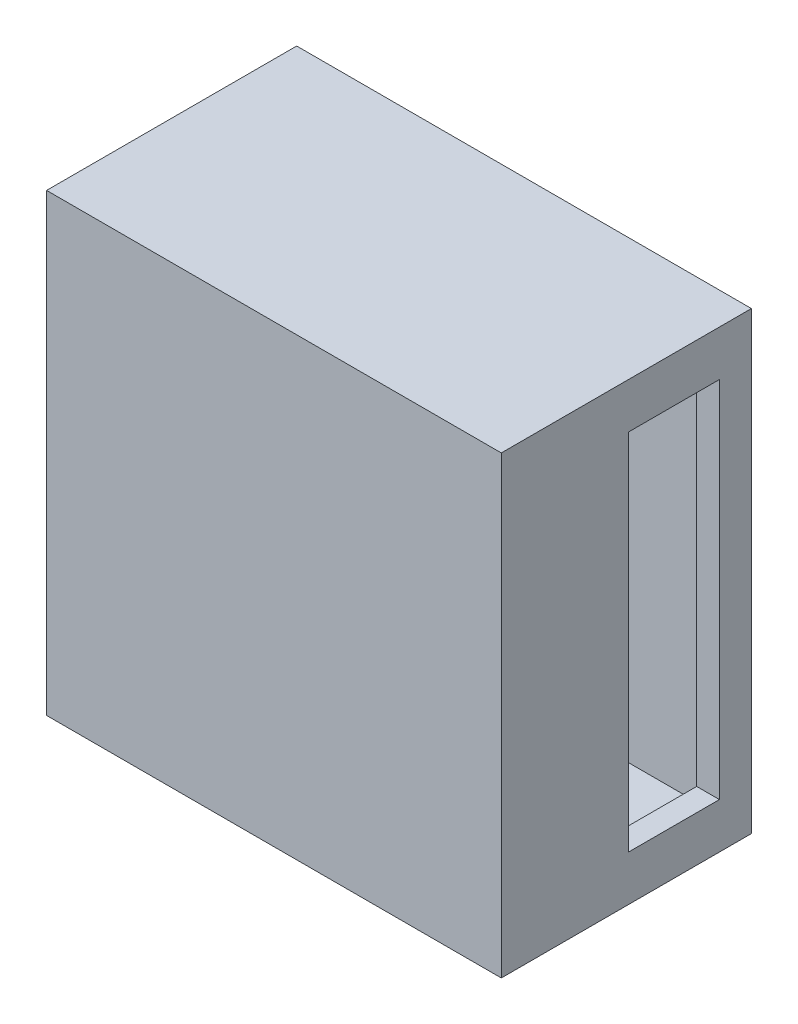
ISO-10303-21;
HEADER;
FILE_DESCRIPTION(('STEP AP214'),'2;1');
FILE_NAME('part.step','',(''),(''),'','','');
FILE_SCHEMA(('AUTOMOTIVE_DESIGN { 1 0 10303 214 1 1 1 1 }'));
ENDSEC;
DATA;
#1=APPLICATION_CONTEXT('core data for automotive mechanical design processes');
#2=APPLICATION_PROTOCOL_DEFINITION('international standard','automotive_design',2000,#1);
#3=PRODUCT_CONTEXT('',#1,'mechanical');
#4=PRODUCT('Part','Part','',(#3));
#5=PRODUCT_RELATED_PRODUCT_CATEGORY('part','',(#4));
#6=PRODUCT_DEFINITION_FORMATION('','',#4);
#7=PRODUCT_DEFINITION_CONTEXT('part definition',#1,'design');
#8=PRODUCT_DEFINITION('design','',#6,#7);
#9=PRODUCT_DEFINITION_SHAPE('','',#8);
#10=(LENGTH_UNIT() NAMED_UNIT(*) SI_UNIT(.MILLI.,.METRE.));
#11=(NAMED_UNIT(*) PLANE_ANGLE_UNIT() SI_UNIT($,.RADIAN.));
#12=(NAMED_UNIT(*) SI_UNIT($,.STERADIAN.) SOLID_ANGLE_UNIT());
#13=UNCERTAINTY_MEASURE_WITH_UNIT(LENGTH_MEASURE(1.E-05),#10,'distance_accuracy_value','');
#14=(GEOMETRIC_REPRESENTATION_CONTEXT(3) GLOBAL_UNCERTAINTY_ASSIGNED_CONTEXT((#13)) GLOBAL_UNIT_ASSIGNED_CONTEXT((#10,
#11,#12)) REPRESENTATION_CONTEXT('',''));
#15=CARTESIAN_POINT('',(0.,0.,0.));
#16=DIRECTION('',(0.,0.,1.));
#17=DIRECTION('',(1.,0.,0.));
#18=AXIS2_PLACEMENT_3D('',#15,#16,#17);
#19=CARTESIAN_POINT('',(50.,-50.,50.));
#20=DIRECTION('',(-1.,0.,0.));
#21=DIRECTION('',(0.,0.,1.));
#22=AXIS2_PLACEMENT_3D('',#19,#20,#21);
#23=PLANE('',#22);
#24=DIRECTION('',(0.,0.,-1.));
#25=VECTOR('',#24,1.);
#26=CARTESIAN_POINT('',(50.,-40.,27.036919811369));
#27=LINE('',#26,#25);
#28=CARTESIAN_POINT('',(50.,-40.,27.036919811369));
#29=VERTEX_POINT('',#28);
#30=CARTESIAN_POINT('',(50.,-40.,7.03691981136901));
#31=VERTEX_POINT('',#30);
#32=EDGE_CURVE('E156',#29,#31,#27,.T.);
#33=ORIENTED_EDGE('',*,*,#32,.F.);
#34=DIRECTION('',(0.,-1.,0.));
#35=VECTOR('',#34,1.);
#36=CARTESIAN_POINT('',(50.,40.,27.036919811369));
#37=LINE('',#36,#35);
#38=CARTESIAN_POINT('',(50.,40.,27.036919811369));
#39=VERTEX_POINT('',#38);
#40=EDGE_CURVE('E51',#39,#29,#37,.T.);
#41=ORIENTED_EDGE('',*,*,#40,.F.);
#42=DIRECTION('',(0.,0.,1.));
#43=VECTOR('',#42,1.);
#44=CARTESIAN_POINT('',(50.,40.,27.036919811369));
#45=LINE('',#44,#43);
#46=CARTESIAN_POINT('',(50.,40.,7.03691981136902));
#47=VERTEX_POINT('',#46);
#48=EDGE_CURVE('E161',#47,#39,#45,.T.);
#49=ORIENTED_EDGE('',*,*,#48,.F.);
#50=DIRECTION('',(0.,1.,0.));
#51=VECTOR('',#50,1.);
#52=CARTESIAN_POINT('',(50.,40.,7.03691981136902));
#53=LINE('',#52,#51);
#54=EDGE_CURVE('E158',#31,#47,#53,.T.);
#55=ORIENTED_EDGE('',*,*,#54,.F.);
#56=EDGE_LOOP('',(#33,#41,#49,#55));
#57=FACE_BOUND('',#56,.T.);
#58=DIRECTION('',(0.,1.,0.));
#59=VECTOR('',#58,1.);
#60=CARTESIAN_POINT('',(50.,-50.,0.));
#61=LINE('',#60,#59);
#62=CARTESIAN_POINT('',(50.,-50.,0.));
#63=VERTEX_POINT('',#62);
#64=CARTESIAN_POINT('',(50.,50.,0.));
#65=VERTEX_POINT('',#64);
#66=EDGE_CURVE('E178',#63,#65,#61,.T.);
#67=ORIENTED_EDGE('',*,*,#66,.T.);
#68=DIRECTION('',(0.,0.,-1.));
#69=VECTOR('',#68,1.);
#70=CARTESIAN_POINT('',(50.,50.,50.));
#71=LINE('',#70,#69);
#72=CARTESIAN_POINT('',(50.,50.,55.));
#73=VERTEX_POINT('',#72);
#74=EDGE_CURVE('E214',#73,#65,#71,.T.);
#75=ORIENTED_EDGE('',*,*,#74,.F.);
#76=DIRECTION('',(0.,1.,0.));
#77=VECTOR('',#76,1.);
#78=CARTESIAN_POINT('',(50.,50.,55.));
#79=LINE('',#78,#77);
#80=CARTESIAN_POINT('',(50.,-50.,55.));
#81=VERTEX_POINT('',#80);
#82=EDGE_CURVE('E145',#81,#73,#79,.T.);
#83=ORIENTED_EDGE('',*,*,#82,.F.);
#84=DIRECTION('',(0.,0.,-1.));
#85=VECTOR('',#84,1.);
#86=CARTESIAN_POINT('',(50.,-50.,50.));
#87=LINE('',#86,#85);
#88=EDGE_CURVE('E136',#81,#63,#87,.T.);
#89=ORIENTED_EDGE('',*,*,#88,.T.);
#90=EDGE_LOOP('',(#67,#75,#83,#89));
#91=FACE_BOUND('',#90,.T.);
#92=ADVANCED_FACE('F37',(#57,#91),#23,.F.);
#93=CARTESIAN_POINT('',(-50.,50.,50.));
#94=DIRECTION('',(0.,-1.,0.));
#95=DIRECTION('',(0.,0.,-1.));
#96=AXIS2_PLACEMENT_3D('',#93,#94,#95);
#97=PLANE('',#96);
#98=DIRECTION('',(-1.,0.,0.));
#99=VECTOR('',#98,1.);
#100=CARTESIAN_POINT('',(-50.,50.,0.));
#101=LINE('',#100,#99);
#102=CARTESIAN_POINT('',(-50.,50.,0.));
#103=VERTEX_POINT('',#102);
#104=EDGE_CURVE('E207',#65,#103,#101,.T.);
#105=ORIENTED_EDGE('',*,*,#104,.T.);
#106=DIRECTION('',(0.,0.,-1.));
#107=VECTOR('',#106,1.);
#108=CARTESIAN_POINT('',(-50.,50.,50.));
#109=LINE('',#108,#107);
#110=CARTESIAN_POINT('',(-50.,50.,55.));
#111=VERTEX_POINT('',#110);
#112=EDGE_CURVE('E135',#111,#103,#109,.T.);
#113=ORIENTED_EDGE('',*,*,#112,.F.);
#114=DIRECTION('',(-1.,0.,0.));
#115=VECTOR('',#114,1.);
#116=CARTESIAN_POINT('',(-50.,50.,55.));
#117=LINE('',#116,#115);
#118=EDGE_CURVE('E150',#73,#111,#117,.T.);
#119=ORIENTED_EDGE('',*,*,#118,.F.);
#120=ORIENTED_EDGE('',*,*,#74,.T.);
#121=EDGE_LOOP('',(#105,#113,#119,#120));
#122=FACE_BOUND('',#121,.T.);
#123=ADVANCED_FACE('F241',(#122),#97,.F.);
#124=CARTESIAN_POINT('',(-50.,-50.,50.));
#125=DIRECTION('',(1.,0.,0.));
#126=DIRECTION('',(0.,0.,-1.));
#127=AXIS2_PLACEMENT_3D('',#124,#125,#126);
#128=PLANE('',#127);
#129=DIRECTION('',(0.,-1.,0.));
#130=VECTOR('',#129,1.);
#131=CARTESIAN_POINT('',(-50.,-50.,0.));
#132=LINE('',#131,#130);
#133=CARTESIAN_POINT('',(-50.,-50.,0.));
#134=VERTEX_POINT('',#133);
#135=EDGE_CURVE('E132',#103,#134,#132,.T.);
#136=ORIENTED_EDGE('',*,*,#135,.T.);
#137=DIRECTION('',(0.,0.,-1.));
#138=VECTOR('',#137,1.);
#139=CARTESIAN_POINT('',(-50.,-50.,50.));
#140=LINE('',#139,#138);
#141=CARTESIAN_POINT('',(-50.,-50.,55.));
#142=VERTEX_POINT('',#141);
#143=EDGE_CURVE('E125',#142,#134,#140,.T.);
#144=ORIENTED_EDGE('',*,*,#143,.F.);
#145=DIRECTION('',(0.,-1.,0.));
#146=VECTOR('',#145,1.);
#147=CARTESIAN_POINT('',(-50.,50.,55.));
#148=LINE('',#147,#146);
#149=EDGE_CURVE('E130',#111,#142,#148,.T.);
#150=ORIENTED_EDGE('',*,*,#149,.F.);
#151=ORIENTED_EDGE('',*,*,#112,.T.);
#152=EDGE_LOOP('',(#136,#144,#150,#151));
#153=FACE_BOUND('',#152,.T.);
#154=ADVANCED_FACE('F127',(#153),#128,.F.);
#155=CARTESIAN_POINT('',(-50.,-50.,50.));
#156=DIRECTION('',(0.,1.,0.));
#157=DIRECTION('',(0.,0.,1.));
#158=AXIS2_PLACEMENT_3D('',#155,#156,#157);
#159=PLANE('',#158);
#160=DIRECTION('',(1.,0.,0.));
#161=VECTOR('',#160,1.);
#162=CARTESIAN_POINT('',(-50.,-50.,0.));
#163=LINE('',#162,#161);
#164=EDGE_CURVE('E210',#134,#63,#163,.T.);
#165=ORIENTED_EDGE('',*,*,#164,.T.);
#166=ORIENTED_EDGE('',*,*,#88,.F.);
#167=DIRECTION('',(1.,0.,0.));
#168=VECTOR('',#167,1.);
#169=CARTESIAN_POINT('',(-50.,-50.,55.));
#170=LINE('',#169,#168);
#171=EDGE_CURVE('E139',#142,#81,#170,.T.);
#172=ORIENTED_EDGE('',*,*,#171,.F.);
#173=ORIENTED_EDGE('',*,*,#143,.T.);
#174=EDGE_LOOP('',(#165,#166,#172,#173));
#175=FACE_BOUND('',#174,.T.);
#176=ADVANCED_FACE('F140',(#175),#159,.F.);
#177=CARTESIAN_POINT('',(0.,0.,0.));
#178=DIRECTION('',(0.,0.,-1.));
#179=DIRECTION('',(-1.,0.,0.));
#180=AXIS2_PLACEMENT_3D('',#177,#178,#179);
#181=PLANE('',#180);
#182=ORIENTED_EDGE('',*,*,#66,.F.);
#183=ORIENTED_EDGE('',*,*,#164,.F.);
#184=ORIENTED_EDGE('',*,*,#135,.F.);
#185=ORIENTED_EDGE('',*,*,#104,.F.);
#186=EDGE_LOOP('',(#182,#183,#184,#185));
#187=FACE_BOUND('',#186,.T.);
#188=ADVANCED_FACE('F244',(#187),#181,.T.);
#189=CARTESIAN_POINT('',(45.,-50.,50.));
#190=DIRECTION('',(-1.,0.,0.));
#191=DIRECTION('',(0.,0.,1.));
#192=AXIS2_PLACEMENT_3D('',#189,#190,#191);
#193=PLANE('',#192);
#194=DIRECTION('',(0.,1.,0.));
#195=VECTOR('',#194,1.);
#196=CARTESIAN_POINT('',(45.,-50.,27.036919811369));
#197=LINE('',#196,#195);
#198=CARTESIAN_POINT('',(45.,-40.,27.036919811369));
#199=VERTEX_POINT('',#198);
#200=CARTESIAN_POINT('',(45.,40.,27.036919811369));
#201=VERTEX_POINT('',#200);
#202=EDGE_CURVE('E11',#199,#201,#197,.T.);
#203=ORIENTED_EDGE('',*,*,#202,.F.);
#204=DIRECTION('',(0.,0.,1.));
#205=VECTOR('',#204,1.);
#206=CARTESIAN_POINT('',(45.,-40.,50.));
#207=LINE('',#206,#205);
#208=CARTESIAN_POINT('',(45.,-40.,7.03691981136901));
#209=VERTEX_POINT('',#208);
#210=EDGE_CURVE('E217',#209,#199,#207,.T.);
#211=ORIENTED_EDGE('',*,*,#210,.F.);
#212=DIRECTION('',(0.,-1.,0.));
#213=VECTOR('',#212,1.);
#214=CARTESIAN_POINT('',(45.,-50.,7.036919811369));
#215=LINE('',#214,#213);
#216=CARTESIAN_POINT('',(45.,40.,7.03691981136902));
#217=VERTEX_POINT('',#216);
#218=EDGE_CURVE('E219',#217,#209,#215,.T.);
#219=ORIENTED_EDGE('',*,*,#218,.F.);
#220=DIRECTION('',(0.,0.,-1.));
#221=VECTOR('',#220,1.);
#222=CARTESIAN_POINT('',(45.,40.,50.));
#223=LINE('',#222,#221);
#224=EDGE_CURVE('E44',#201,#217,#223,.T.);
#225=ORIENTED_EDGE('',*,*,#224,.F.);
#226=EDGE_LOOP('',(#203,#211,#219,#225));
#227=FACE_BOUND('',#226,.T.);
#228=DIRECTION('',(0.,1.,0.));
#229=VECTOR('',#228,1.);
#230=CARTESIAN_POINT('',(45.,0.,5.));
#231=LINE('',#230,#229);
#232=CARTESIAN_POINT('',(45.,-45.,5.));
#233=VERTEX_POINT('',#232);
#234=CARTESIAN_POINT('',(45.,45.,5.));
#235=VERTEX_POINT('',#234);
#236=EDGE_CURVE('E167',#233,#235,#231,.T.);
#237=ORIENTED_EDGE('',*,*,#236,.F.);
#238=DIRECTION('',(0.,0.,-1.));
#239=VECTOR('',#238,1.);
#240=CARTESIAN_POINT('',(45.,-45.,50.));
#241=LINE('',#240,#239);
#242=CARTESIAN_POINT('',(45.,-45.,50.));
#243=VERTEX_POINT('',#242);
#244=EDGE_CURVE('E180',#243,#233,#241,.T.);
#245=ORIENTED_EDGE('',*,*,#244,.F.);
#246=DIRECTION('',(0.,1.,0.));
#247=VECTOR('',#246,1.);
#248=CARTESIAN_POINT('',(45.,0.,50.));
#249=LINE('',#248,#247);
#250=CARTESIAN_POINT('',(45.,45.,50.));
#251=VERTEX_POINT('',#250);
#252=EDGE_CURVE('E194',#243,#251,#249,.T.);
#253=ORIENTED_EDGE('',*,*,#252,.T.);
#254=DIRECTION('',(0.,0.,-1.));
#255=VECTOR('',#254,1.);
#256=CARTESIAN_POINT('',(45.,45.,50.));
#257=LINE('',#256,#255);
#258=EDGE_CURVE('E175',#251,#235,#257,.T.);
#259=ORIENTED_EDGE('',*,*,#258,.T.);
#260=EDGE_LOOP('',(#237,#245,#253,#259));
#261=FACE_BOUND('',#260,.T.);
#262=ADVANCED_FACE('F233',(#227,#261),#193,.T.);
#263=CARTESIAN_POINT('',(-50.,45.,50.));
#264=DIRECTION('',(0.,-1.,0.));
#265=DIRECTION('',(0.,0.,-1.));
#266=AXIS2_PLACEMENT_3D('',#263,#264,#265);
#267=PLANE('',#266);
#268=DIRECTION('',(-1.,0.,0.));
#269=VECTOR('',#268,1.);
#270=CARTESIAN_POINT('',(0.,45.,5.));
#271=LINE('',#270,#269);
#272=CARTESIAN_POINT('',(-45.,45.,5.));
#273=VERTEX_POINT('',#272);
#274=EDGE_CURVE('E174',#235,#273,#271,.T.);
#275=ORIENTED_EDGE('',*,*,#274,.F.);
#276=ORIENTED_EDGE('',*,*,#258,.F.);
#277=DIRECTION('',(-1.,0.,0.));
#278=VECTOR('',#277,1.);
#279=CARTESIAN_POINT('',(0.,45.,50.));
#280=LINE('',#279,#278);
#281=CARTESIAN_POINT('',(-45.,45.,50.));
#282=VERTEX_POINT('',#281);
#283=EDGE_CURVE('E197',#251,#282,#280,.T.);
#284=ORIENTED_EDGE('',*,*,#283,.T.);
#285=DIRECTION('',(0.,0.,-1.));
#286=VECTOR('',#285,1.);
#287=CARTESIAN_POINT('',(-45.,45.,50.));
#288=LINE('',#287,#286);
#289=EDGE_CURVE('E179',#282,#273,#288,.T.);
#290=ORIENTED_EDGE('',*,*,#289,.T.);
#291=EDGE_LOOP('',(#275,#276,#284,#290));
#292=FACE_BOUND('',#291,.T.);
#293=ADVANCED_FACE('F267',(#292),#267,.T.);
#294=CARTESIAN_POINT('',(-45.,-50.,50.));
#295=DIRECTION('',(1.,0.,0.));
#296=DIRECTION('',(0.,0.,-1.));
#297=AXIS2_PLACEMENT_3D('',#294,#295,#296);
#298=PLANE('',#297);
#299=DIRECTION('',(0.,-1.,0.));
#300=VECTOR('',#299,1.);
#301=CARTESIAN_POINT('',(-45.,0.,5.));
#302=LINE('',#301,#300);
#303=CARTESIAN_POINT('',(-45.,-45.,5.));
#304=VERTEX_POINT('',#303);
#305=EDGE_CURVE('E186',#273,#304,#302,.T.);
#306=ORIENTED_EDGE('',*,*,#305,.F.);
#307=ORIENTED_EDGE('',*,*,#289,.F.);
#308=DIRECTION('',(0.,-1.,0.));
#309=VECTOR('',#308,1.);
#310=CARTESIAN_POINT('',(-45.,0.,50.));
#311=LINE('',#310,#309);
#312=CARTESIAN_POINT('',(-45.,-45.,50.));
#313=VERTEX_POINT('',#312);
#314=EDGE_CURVE('E200',#282,#313,#311,.T.);
#315=ORIENTED_EDGE('',*,*,#314,.T.);
#316=DIRECTION('',(0.,0.,-1.));
#317=VECTOR('',#316,1.);
#318=CARTESIAN_POINT('',(-45.,-45.,50.));
#319=LINE('',#318,#317);
#320=EDGE_CURVE('E183',#313,#304,#319,.T.);
#321=ORIENTED_EDGE('',*,*,#320,.T.);
#322=EDGE_LOOP('',(#306,#307,#315,#321));
#323=FACE_BOUND('',#322,.T.);
#324=ADVANCED_FACE('F263',(#323),#298,.T.);
#325=CARTESIAN_POINT('',(-50.,-45.,50.));
#326=DIRECTION('',(0.,1.,0.));
#327=DIRECTION('',(0.,0.,1.));
#328=AXIS2_PLACEMENT_3D('',#325,#326,#327);
#329=PLANE('',#328);
#330=DIRECTION('',(1.,0.,0.));
#331=VECTOR('',#330,1.);
#332=CARTESIAN_POINT('',(0.,-45.,5.));
#333=LINE('',#332,#331);
#334=EDGE_CURVE('E190',#304,#233,#333,.T.);
#335=ORIENTED_EDGE('',*,*,#334,.F.);
#336=ORIENTED_EDGE('',*,*,#320,.F.);
#337=DIRECTION('',(1.,0.,0.));
#338=VECTOR('',#337,1.);
#339=CARTESIAN_POINT('',(0.,-45.,50.));
#340=LINE('',#339,#338);
#341=EDGE_CURVE('E184',#313,#243,#340,.T.);
#342=ORIENTED_EDGE('',*,*,#341,.T.);
#343=ORIENTED_EDGE('',*,*,#244,.T.);
#344=EDGE_LOOP('',(#335,#336,#342,#343));
#345=FACE_BOUND('',#344,.T.);
#346=ADVANCED_FACE('F259',(#345),#329,.T.);
#347=CARTESIAN_POINT('',(0.,0.,5.));
#348=DIRECTION('',(0.,0.,-1.));
#349=DIRECTION('',(-1.,0.,0.));
#350=AXIS2_PLACEMENT_3D('',#347,#348,#349);
#351=PLANE('',#350);
#352=ORIENTED_EDGE('',*,*,#236,.T.);
#353=ORIENTED_EDGE('',*,*,#274,.T.);
#354=ORIENTED_EDGE('',*,*,#305,.T.);
#355=ORIENTED_EDGE('',*,*,#334,.T.);
#356=EDGE_LOOP('',(#352,#353,#354,#355));
#357=FACE_BOUND('',#356,.T.);
#358=ADVANCED_FACE('F256',(#357),#351,.F.);
#359=CARTESIAN_POINT('',(31.,40.,27.036919811369));
#360=DIRECTION('',(0.,0.,1.));
#361=DIRECTION('',(0.,-1.,0.));
#362=AXIS2_PLACEMENT_3D('',#359,#360,#361);
#363=PLANE('',#362);
#364=ORIENTED_EDGE('',*,*,#202,.T.);
#365=DIRECTION('',(1.,0.,0.));
#366=VECTOR('',#365,1.);
#367=CARTESIAN_POINT('',(31.,40.,27.036919811369));
#368=LINE('',#367,#366);
#369=EDGE_CURVE('E165',#201,#39,#368,.T.);
#370=ORIENTED_EDGE('',*,*,#369,.T.);
#371=ORIENTED_EDGE('',*,*,#40,.T.);
#372=DIRECTION('',(1.,0.,0.));
#373=VECTOR('',#372,1.);
#374=CARTESIAN_POINT('',(31.,-40.,27.036919811369));
#375=LINE('',#374,#373);
#376=EDGE_CURVE('E164',#199,#29,#375,.T.);
#377=ORIENTED_EDGE('',*,*,#376,.F.);
#378=EDGE_LOOP('',(#364,#370,#371,#377));
#379=FACE_BOUND('',#378,.T.);
#380=ADVANCED_FACE('F237',(#379),#363,.F.);
#381=CARTESIAN_POINT('',(31.,40.,27.036919811369));
#382=DIRECTION('',(0.,1.,0.));
#383=DIRECTION('',(0.,0.,1.));
#384=AXIS2_PLACEMENT_3D('',#381,#382,#383);
#385=PLANE('',#384);
#386=ORIENTED_EDGE('',*,*,#224,.T.);
#387=DIRECTION('',(1.,0.,0.));
#388=VECTOR('',#387,1.);
#389=CARTESIAN_POINT('',(31.,40.,7.03691981136902));
#390=LINE('',#389,#388);
#391=EDGE_CURVE('E168',#217,#47,#390,.T.);
#392=ORIENTED_EDGE('',*,*,#391,.T.);
#393=ORIENTED_EDGE('',*,*,#48,.T.);
#394=ORIENTED_EDGE('',*,*,#369,.F.);
#395=EDGE_LOOP('',(#386,#392,#393,#394));
#396=FACE_BOUND('',#395,.T.);
#397=ADVANCED_FACE('F224',(#396),#385,.F.);
#398=CARTESIAN_POINT('',(31.,40.,7.03691981136902));
#399=DIRECTION('',(0.,0.,-1.));
#400=DIRECTION('',(0.,1.,0.));
#401=AXIS2_PLACEMENT_3D('',#398,#399,#400);
#402=PLANE('',#401);
#403=ORIENTED_EDGE('',*,*,#218,.T.);
#404=DIRECTION('',(1.,0.,0.));
#405=VECTOR('',#404,1.);
#406=CARTESIAN_POINT('',(31.,-40.,7.03691981136901));
#407=LINE('',#406,#405);
#408=EDGE_CURVE('E59',#209,#31,#407,.T.);
#409=ORIENTED_EDGE('',*,*,#408,.T.);
#410=ORIENTED_EDGE('',*,*,#54,.T.);
#411=ORIENTED_EDGE('',*,*,#391,.F.);
#412=EDGE_LOOP('',(#403,#409,#410,#411));
#413=FACE_BOUND('',#412,.T.);
#414=ADVANCED_FACE('F229',(#413),#402,.F.);
#415=CARTESIAN_POINT('',(31.,-40.,27.036919811369));
#416=DIRECTION('',(0.,-1.,0.));
#417=DIRECTION('',(0.,0.,-1.));
#418=AXIS2_PLACEMENT_3D('',#415,#416,#417);
#419=PLANE('',#418);
#420=ORIENTED_EDGE('',*,*,#210,.T.);
#421=ORIENTED_EDGE('',*,*,#376,.T.);
#422=ORIENTED_EDGE('',*,*,#32,.T.);
#423=ORIENTED_EDGE('',*,*,#408,.F.);
#424=EDGE_LOOP('',(#420,#421,#422,#423));
#425=FACE_BOUND('',#424,.T.);
#426=ADVANCED_FACE('F235',(#425),#419,.F.);
#427=CARTESIAN_POINT('',(0.,0.,50.));
#428=DIRECTION('',(0.,0.,1.));
#429=DIRECTION('',(1.,0.,0.));
#430=AXIS2_PLACEMENT_3D('',#427,#428,#429);
#431=PLANE('',#430);
#432=ORIENTED_EDGE('',*,*,#252,.F.);
#433=ORIENTED_EDGE('',*,*,#341,.F.);
#434=ORIENTED_EDGE('',*,*,#314,.F.);
#435=ORIENTED_EDGE('',*,*,#283,.F.);
#436=EDGE_LOOP('',(#432,#433,#434,#435));
#437=FACE_BOUND('',#436,.T.);
#438=ADVANCED_FACE('F278',(#437),#431,.F.);
#439=CARTESIAN_POINT('',(0.,0.,55.));
#440=DIRECTION('',(0.,0.,1.));
#441=DIRECTION('',(1.,0.,0.));
#442=AXIS2_PLACEMENT_3D('',#439,#440,#441);
#443=PLANE('',#442);
#444=ORIENTED_EDGE('',*,*,#149,.T.);
#445=ORIENTED_EDGE('',*,*,#171,.T.);
#446=ORIENTED_EDGE('',*,*,#82,.T.);
#447=ORIENTED_EDGE('',*,*,#118,.T.);
#448=EDGE_LOOP('',(#444,#445,#446,#447));
#449=FACE_BOUND('',#448,.T.);
#450=ADVANCED_FACE('F148',(#449),#443,.T.);
#451=CLOSED_SHELL('',(#92,#123,#154,#176,#188,#262,#293,#324,#346,#358,#380,#397,#414,#426,#438,#450));
#452=MANIFOLD_SOLID_BREP('B2',#451);
#453=ADVANCED_BREP_SHAPE_REPRESENTATION('',(#18,#452),#14);
#454=SHAPE_DEFINITION_REPRESENTATION(#9,#453);
ENDSEC;
END-ISO-10303-21;
